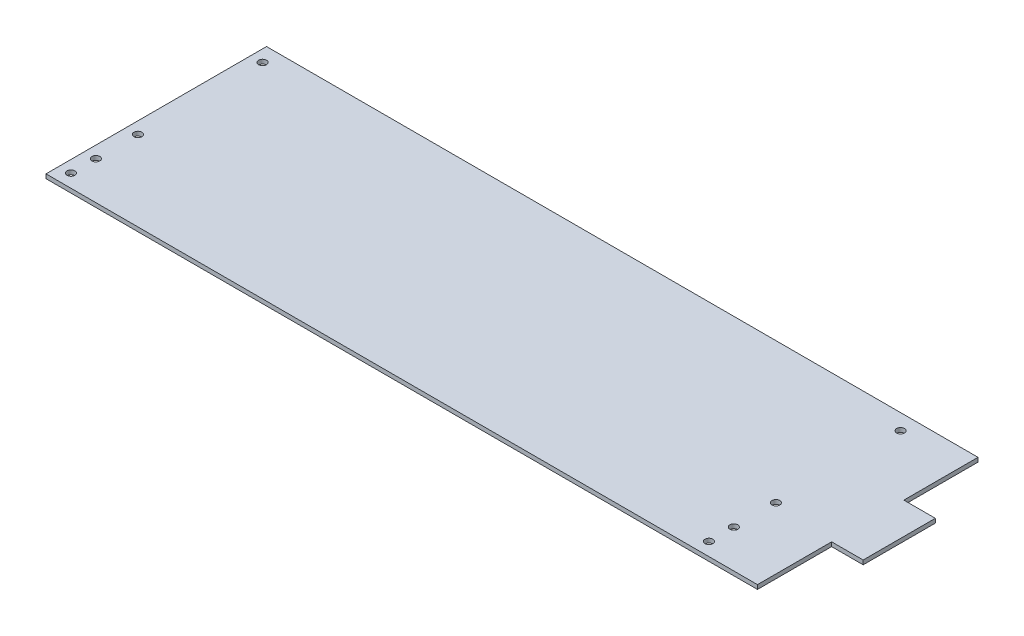
ISO-10303-21;
HEADER;
FILE_DESCRIPTION(('STEP AP214'),'2;1');
FILE_NAME('part.step','',(''),(''),'','','');
FILE_SCHEMA(('AUTOMOTIVE_DESIGN { 1 0 10303 214 1 1 1 1 }'));
ENDSEC;
DATA;
#1=APPLICATION_CONTEXT('core data for automotive mechanical design processes');
#2=APPLICATION_PROTOCOL_DEFINITION('international standard','automotive_design',2000,#1);
#3=PRODUCT_CONTEXT('',#1,'mechanical');
#4=PRODUCT('Part','Part','',(#3));
#5=PRODUCT_RELATED_PRODUCT_CATEGORY('part','',(#4));
#6=PRODUCT_DEFINITION_FORMATION('','',#4);
#7=PRODUCT_DEFINITION_CONTEXT('part definition',#1,'design');
#8=PRODUCT_DEFINITION('design','',#6,#7);
#9=PRODUCT_DEFINITION_SHAPE('','',#8);
#10=(LENGTH_UNIT() NAMED_UNIT(*) SI_UNIT(.MILLI.,.METRE.));
#11=(NAMED_UNIT(*) PLANE_ANGLE_UNIT() SI_UNIT($,.RADIAN.));
#12=(NAMED_UNIT(*) SI_UNIT($,.STERADIAN.) SOLID_ANGLE_UNIT());
#13=UNCERTAINTY_MEASURE_WITH_UNIT(LENGTH_MEASURE(1.E-05),#10,'distance_accuracy_value','');
#14=(GEOMETRIC_REPRESENTATION_CONTEXT(3) GLOBAL_UNCERTAINTY_ASSIGNED_CONTEXT((#13)) GLOBAL_UNIT_ASSIGNED_CONTEXT((#10,
#11,#12)) REPRESENTATION_CONTEXT('',''));
#15=CARTESIAN_POINT('',(0.,0.,0.));
#16=DIRECTION('',(0.,0.,1.));
#17=DIRECTION('',(1.,0.,0.));
#18=AXIS2_PLACEMENT_3D('',#15,#16,#17);
#19=CARTESIAN_POINT('',(283.,1.6,0.));
#20=DIRECTION('',(1.,0.,0.));
#21=DIRECTION('',(0.,0.,-1.));
#22=AXIS2_PLACEMENT_3D('',#19,#20,#21);
#23=PLANE('',#22);
#24=DIRECTION('',(0.,0.,1.));
#25=VECTOR('',#24,1.);
#26=CARTESIAN_POINT('',(283.,0.,0.));
#27=LINE('',#26,#25);
#28=CARTESIAN_POINT('',(283.,0.,-55.75));
#29=VERTEX_POINT('',#28);
#30=CARTESIAN_POINT('',(283.,0.,-28.25));
#31=VERTEX_POINT('',#30);
#32=EDGE_CURVE('E158',#29,#31,#27,.T.);
#33=ORIENTED_EDGE('',*,*,#32,.F.);
#34=DIRECTION('',(0.,-1.,0.));
#35=VECTOR('',#34,1.);
#36=CARTESIAN_POINT('',(283.,1.6,-55.75));
#37=LINE('',#36,#35);
#38=CARTESIAN_POINT('',(283.,1.6,-55.75));
#39=VERTEX_POINT('',#38);
#40=EDGE_CURVE('E11',#39,#29,#37,.T.);
#41=ORIENTED_EDGE('',*,*,#40,.F.);
#42=DIRECTION('',(0.,0.,1.));
#43=VECTOR('',#42,1.);
#44=CARTESIAN_POINT('',(283.,1.6,0.));
#45=LINE('',#44,#43);
#46=CARTESIAN_POINT('',(283.,1.6,-28.25));
#47=VERTEX_POINT('',#46);
#48=EDGE_CURVE('E202',#39,#47,#45,.T.);
#49=ORIENTED_EDGE('',*,*,#48,.T.);
#50=DIRECTION('',(0.,-1.,0.));
#51=VECTOR('',#50,1.);
#52=CARTESIAN_POINT('',(283.,1.6,-28.25));
#53=LINE('',#52,#51);
#54=EDGE_CURVE('E55',#47,#31,#53,.T.);
#55=ORIENTED_EDGE('',*,*,#54,.T.);
#56=EDGE_LOOP('',(#33,#41,#49,#55));
#57=FACE_BOUND('',#56,.T.);
#58=ADVANCED_FACE('F39',(#57),#23,.T.);
#59=CARTESIAN_POINT('',(0.,1.6,-55.75));
#60=DIRECTION('',(0.,0.,1.));
#61=DIRECTION('',(1.,0.,0.));
#62=AXIS2_PLACEMENT_3D('',#59,#60,#61);
#63=PLANE('',#62);
#64=DIRECTION('',(-1.,0.,0.));
#65=VECTOR('',#64,1.);
#66=CARTESIAN_POINT('',(0.,0.,-55.75));
#67=LINE('',#66,#65);
#68=CARTESIAN_POINT('',(271.,0.,-55.75));
#69=VERTEX_POINT('',#68);
#70=EDGE_CURVE('E160',#29,#69,#67,.T.);
#71=ORIENTED_EDGE('',*,*,#70,.T.);
#72=DIRECTION('',(0.,-1.,0.));
#73=VECTOR('',#72,1.);
#74=CARTESIAN_POINT('',(271.,1.6,-55.75));
#75=LINE('',#74,#73);
#76=CARTESIAN_POINT('',(271.,1.6,-55.75));
#77=VERTEX_POINT('',#76);
#78=EDGE_CURVE('E47',#77,#69,#75,.T.);
#79=ORIENTED_EDGE('',*,*,#78,.F.);
#80=DIRECTION('',(-1.,0.,0.));
#81=VECTOR('',#80,1.);
#82=CARTESIAN_POINT('',(0.,1.6,-55.75));
#83=LINE('',#82,#81);
#84=EDGE_CURVE('E228',#39,#77,#83,.T.);
#85=ORIENTED_EDGE('',*,*,#84,.F.);
#86=ORIENTED_EDGE('',*,*,#40,.T.);
#87=EDGE_LOOP('',(#71,#79,#85,#86));
#88=FACE_BOUND('',#87,.T.);
#89=ADVANCED_FACE('F218',(#88),#63,.F.);
#90=CARTESIAN_POINT('',(271.,1.6,0.));
#91=DIRECTION('',(1.,0.,0.));
#92=DIRECTION('',(0.,0.,-1.));
#93=AXIS2_PLACEMENT_3D('',#90,#91,#92);
#94=PLANE('',#93);
#95=DIRECTION('',(0.,0.,1.));
#96=VECTOR('',#95,1.);
#97=CARTESIAN_POINT('',(271.,0.,0.));
#98=LINE('',#97,#96);
#99=CARTESIAN_POINT('',(271.,0.,-84.));
#100=VERTEX_POINT('',#99);
#101=EDGE_CURVE('E163',#100,#69,#98,.T.);
#102=ORIENTED_EDGE('',*,*,#101,.F.);
#103=DIRECTION('',(0.,-1.,0.));
#104=VECTOR('',#103,1.);
#105=CARTESIAN_POINT('',(271.,1.6,-84.));
#106=LINE('',#105,#104);
#107=CARTESIAN_POINT('',(271.,1.6,-84.));
#108=VERTEX_POINT('',#107);
#109=EDGE_CURVE('E208',#108,#100,#106,.T.);
#110=ORIENTED_EDGE('',*,*,#109,.F.);
#111=DIRECTION('',(0.,0.,1.));
#112=VECTOR('',#111,1.);
#113=CARTESIAN_POINT('',(271.,1.6,0.));
#114=LINE('',#113,#112);
#115=EDGE_CURVE('E215',#108,#77,#114,.T.);
#116=ORIENTED_EDGE('',*,*,#115,.T.);
#117=ORIENTED_EDGE('',*,*,#78,.T.);
#118=EDGE_LOOP('',(#102,#110,#116,#117));
#119=FACE_BOUND('',#118,.T.);
#120=ADVANCED_FACE('F213',(#119),#94,.T.);
#121=CARTESIAN_POINT('',(0.,1.6,-84.));
#122=DIRECTION('',(0.,0.,-1.));
#123=DIRECTION('',(-1.,0.,0.));
#124=AXIS2_PLACEMENT_3D('',#121,#122,#123);
#125=PLANE('',#124);
#126=DIRECTION('',(1.,0.,0.));
#127=VECTOR('',#126,1.);
#128=CARTESIAN_POINT('',(0.,0.,-84.));
#129=LINE('',#128,#127);
#130=CARTESIAN_POINT('',(0.,0.,-84.));
#131=VERTEX_POINT('',#130);
#132=EDGE_CURVE('E166',#131,#100,#129,.T.);
#133=ORIENTED_EDGE('',*,*,#132,.F.);
#134=DIRECTION('',(0.,-1.,0.));
#135=VECTOR('',#134,1.);
#136=CARTESIAN_POINT('',(0.,1.6,-84.));
#137=LINE('',#136,#135);
#138=CARTESIAN_POINT('',(0.,1.6,-84.));
#139=VERTEX_POINT('',#138);
#140=EDGE_CURVE('E206',#139,#131,#137,.T.);
#141=ORIENTED_EDGE('',*,*,#140,.F.);
#142=DIRECTION('',(1.,0.,0.));
#143=VECTOR('',#142,1.);
#144=CARTESIAN_POINT('',(0.,1.6,-84.));
#145=LINE('',#144,#143);
#146=EDGE_CURVE('E227',#139,#108,#145,.T.);
#147=ORIENTED_EDGE('',*,*,#146,.T.);
#148=ORIENTED_EDGE('',*,*,#109,.T.);
#149=EDGE_LOOP('',(#133,#141,#147,#148));
#150=FACE_BOUND('',#149,.T.);
#151=ADVANCED_FACE('F225',(#150),#125,.T.);
#152=CARTESIAN_POINT('',(0.,1.6,0.));
#153=DIRECTION('',(-1.,0.,0.));
#154=DIRECTION('',(0.,0.,1.));
#155=AXIS2_PLACEMENT_3D('',#152,#153,#154);
#156=PLANE('',#155);
#157=DIRECTION('',(0.,0.,-1.));
#158=VECTOR('',#157,1.);
#159=CARTESIAN_POINT('',(0.,0.,0.));
#160=LINE('',#159,#158);
#161=CARTESIAN_POINT('',(0.,0.,0.));
#162=VERTEX_POINT('',#161);
#163=EDGE_CURVE('E169',#162,#131,#160,.T.);
#164=ORIENTED_EDGE('',*,*,#163,.F.);
#165=DIRECTION('',(0.,-1.,0.));
#166=VECTOR('',#165,1.);
#167=CARTESIAN_POINT('',(0.,1.6,0.));
#168=LINE('',#167,#166);
#169=CARTESIAN_POINT('',(0.,1.6,0.));
#170=VERTEX_POINT('',#169);
#171=EDGE_CURVE('E126',#170,#162,#168,.T.);
#172=ORIENTED_EDGE('',*,*,#171,.F.);
#173=DIRECTION('',(0.,0.,-1.));
#174=VECTOR('',#173,1.);
#175=CARTESIAN_POINT('',(0.,1.6,0.));
#176=LINE('',#175,#174);
#177=EDGE_CURVE('E116',#170,#139,#176,.T.);
#178=ORIENTED_EDGE('',*,*,#177,.T.);
#179=ORIENTED_EDGE('',*,*,#140,.T.);
#180=EDGE_LOOP('',(#164,#172,#178,#179));
#181=FACE_BOUND('',#180,.T.);
#182=ADVANCED_FACE('F234',(#181),#156,.T.);
#183=CARTESIAN_POINT('',(0.,1.6,0.));
#184=DIRECTION('',(0.,0.,-1.));
#185=DIRECTION('',(-1.,0.,0.));
#186=AXIS2_PLACEMENT_3D('',#183,#184,#185);
#187=PLANE('',#186);
#188=DIRECTION('',(1.,0.,0.));
#189=VECTOR('',#188,1.);
#190=CARTESIAN_POINT('',(0.,0.,0.));
#191=LINE('',#190,#189);
#192=CARTESIAN_POINT('',(271.,0.,0.));
#193=VERTEX_POINT('',#192);
#194=EDGE_CURVE('E123',#162,#193,#191,.T.);
#195=ORIENTED_EDGE('',*,*,#194,.T.);
#196=DIRECTION('',(0.,-1.,0.));
#197=VECTOR('',#196,1.);
#198=CARTESIAN_POINT('',(271.,1.6,0.));
#199=LINE('',#198,#197);
#200=CARTESIAN_POINT('',(271.,1.6,0.));
#201=VERTEX_POINT('',#200);
#202=EDGE_CURVE('E120',#201,#193,#199,.T.);
#203=ORIENTED_EDGE('',*,*,#202,.F.);
#204=DIRECTION('',(1.,0.,0.));
#205=VECTOR('',#204,1.);
#206=CARTESIAN_POINT('',(0.,1.6,0.));
#207=LINE('',#206,#205);
#208=EDGE_CURVE('E106',#170,#201,#207,.T.);
#209=ORIENTED_EDGE('',*,*,#208,.F.);
#210=ORIENTED_EDGE('',*,*,#171,.T.);
#211=EDGE_LOOP('',(#195,#203,#209,#210));
#212=FACE_BOUND('',#211,.T.);
#213=ADVANCED_FACE('F121',(#212),#187,.F.);
#214=CARTESIAN_POINT('',(271.,1.6,0.));
#215=DIRECTION('',(1.,0.,0.));
#216=DIRECTION('',(0.,0.,-1.));
#217=AXIS2_PLACEMENT_3D('',#214,#215,#216);
#218=PLANE('',#217);
#219=DIRECTION('',(0.,0.,1.));
#220=VECTOR('',#219,1.);
#221=CARTESIAN_POINT('',(271.,0.,0.));
#222=LINE('',#221,#220);
#223=CARTESIAN_POINT('',(271.,0.,-28.25));
#224=VERTEX_POINT('',#223);
#225=EDGE_CURVE('E173',#224,#193,#222,.T.);
#226=ORIENTED_EDGE('',*,*,#225,.F.);
#227=DIRECTION('',(0.,-1.,0.));
#228=VECTOR('',#227,1.);
#229=CARTESIAN_POINT('',(271.,1.6,-28.25));
#230=LINE('',#229,#228);
#231=CARTESIAN_POINT('',(271.,1.6,-28.25));
#232=VERTEX_POINT('',#231);
#233=EDGE_CURVE('E80',#232,#224,#230,.T.);
#234=ORIENTED_EDGE('',*,*,#233,.F.);
#235=DIRECTION('',(0.,0.,1.));
#236=VECTOR('',#235,1.);
#237=CARTESIAN_POINT('',(271.,1.6,0.));
#238=LINE('',#237,#236);
#239=EDGE_CURVE('E113',#232,#201,#238,.T.);
#240=ORIENTED_EDGE('',*,*,#239,.T.);
#241=ORIENTED_EDGE('',*,*,#202,.T.);
#242=EDGE_LOOP('',(#226,#234,#240,#241));
#243=FACE_BOUND('',#242,.T.);
#244=ADVANCED_FACE('F128',(#243),#218,.T.);
#245=CARTESIAN_POINT('',(4.5,1.6,-4.99999999999998));
#246=DIRECTION('',(0.,-1.,0.));
#247=DIRECTION('',(0.,0.,-1.));
#248=AXIS2_PLACEMENT_3D('',#245,#246,#247);
#249=CYLINDRICAL_SURFACE('',#248,1.5);
#250=CARTESIAN_POINT('',(4.5,1.6,-4.99999999999998));
#251=DIRECTION('',(0.,1.,0.));
#252=DIRECTION('',(0.,0.,1.));
#253=AXIS2_PLACEMENT_3D('',#250,#251,#252);
#254=CIRCLE('',#253,1.5);
#255=CARTESIAN_POINT('',(4.5,1.6,-3.49999999999998));
#256=VERTEX_POINT('',#255);
#257=EDGE_CURVE('E152',#256,#256,#254,.T.);
#258=ORIENTED_EDGE('',*,*,#257,.T.);
#259=EDGE_LOOP('',(#258));
#260=FACE_BOUND('',#259,.T.);
#261=CARTESIAN_POINT('',(4.5,0.,-4.99999999999998));
#262=DIRECTION('',(0.,1.,0.));
#263=DIRECTION('',(0.,0.,1.));
#264=AXIS2_PLACEMENT_3D('',#261,#262,#263);
#265=CIRCLE('',#264,1.5);
#266=CARTESIAN_POINT('',(4.5,0.,-3.49999999999998));
#267=VERTEX_POINT('',#266);
#268=EDGE_CURVE('E196',#267,#267,#265,.T.);
#269=ORIENTED_EDGE('',*,*,#268,.F.);
#270=EDGE_LOOP('',(#269));
#271=FACE_BOUND('',#270,.T.);
#272=ADVANCED_FACE('F265',(#260,#271),#249,.F.);
#273=CARTESIAN_POINT('',(4.5,1.6,-14.5));
#274=DIRECTION('',(0.,-1.,0.));
#275=DIRECTION('',(0.,0.,-1.));
#276=AXIS2_PLACEMENT_3D('',#273,#274,#275);
#277=CYLINDRICAL_SURFACE('',#276,1.5);
#278=CARTESIAN_POINT('',(4.5,1.6,-14.5));
#279=DIRECTION('',(0.,1.,0.));
#280=DIRECTION('',(0.,0.,1.));
#281=AXIS2_PLACEMENT_3D('',#278,#279,#280);
#282=CIRCLE('',#281,1.5);
#283=CARTESIAN_POINT('',(4.5,1.6,-13.));
#284=VERTEX_POINT('',#283);
#285=EDGE_CURVE('E149',#284,#284,#282,.T.);
#286=ORIENTED_EDGE('',*,*,#285,.T.);
#287=EDGE_LOOP('',(#286));
#288=FACE_BOUND('',#287,.T.);
#289=CARTESIAN_POINT('',(4.5,0.,-14.5));
#290=DIRECTION('',(0.,1.,0.));
#291=DIRECTION('',(0.,0.,1.));
#292=AXIS2_PLACEMENT_3D('',#289,#290,#291);
#293=CIRCLE('',#292,1.5);
#294=CARTESIAN_POINT('',(4.5,0.,-13.));
#295=VERTEX_POINT('',#294);
#296=EDGE_CURVE('E193',#295,#295,#293,.T.);
#297=ORIENTED_EDGE('',*,*,#296,.F.);
#298=EDGE_LOOP('',(#297));
#299=FACE_BOUND('',#298,.T.);
#300=ADVANCED_FACE('F269',(#288,#299),#277,.F.);
#301=CARTESIAN_POINT('',(4.5,1.6,-30.5));
#302=DIRECTION('',(0.,-1.,0.));
#303=DIRECTION('',(0.,0.,-1.));
#304=AXIS2_PLACEMENT_3D('',#301,#302,#303);
#305=CYLINDRICAL_SURFACE('',#304,1.5);
#306=CARTESIAN_POINT('',(4.5,1.6,-30.5));
#307=DIRECTION('',(0.,1.,0.));
#308=DIRECTION('',(0.,0.,1.));
#309=AXIS2_PLACEMENT_3D('',#306,#307,#308);
#310=CIRCLE('',#309,1.5);
#311=CARTESIAN_POINT('',(4.5,1.6,-29.));
#312=VERTEX_POINT('',#311);
#313=EDGE_CURVE('E146',#312,#312,#310,.T.);
#314=ORIENTED_EDGE('',*,*,#313,.T.);
#315=EDGE_LOOP('',(#314));
#316=FACE_BOUND('',#315,.T.);
#317=CARTESIAN_POINT('',(4.5,0.,-30.5));
#318=DIRECTION('',(0.,1.,0.));
#319=DIRECTION('',(0.,0.,1.));
#320=AXIS2_PLACEMENT_3D('',#317,#318,#319);
#321=CIRCLE('',#320,1.5);
#322=CARTESIAN_POINT('',(4.5,0.,-29.));
#323=VERTEX_POINT('',#322);
#324=EDGE_CURVE('E190',#323,#323,#321,.T.);
#325=ORIENTED_EDGE('',*,*,#324,.F.);
#326=EDGE_LOOP('',(#325));
#327=FACE_BOUND('',#326,.T.);
#328=ADVANCED_FACE('F275',(#316,#327),#305,.F.);
#329=CARTESIAN_POINT('',(247.5,1.6,-14.5));
#330=DIRECTION('',(0.,-1.,0.));
#331=DIRECTION('',(0.,0.,-1.));
#332=AXIS2_PLACEMENT_3D('',#329,#330,#331);
#333=CYLINDRICAL_SURFACE('',#332,1.5);
#334=CARTESIAN_POINT('',(247.5,1.6,-14.5));
#335=DIRECTION('',(0.,1.,0.));
#336=DIRECTION('',(0.,0.,1.));
#337=AXIS2_PLACEMENT_3D('',#334,#335,#336);
#338=CIRCLE('',#337,1.5);
#339=CARTESIAN_POINT('',(247.5,1.6,-13.));
#340=VERTEX_POINT('',#339);
#341=EDGE_CURVE('E143',#340,#340,#338,.F.);
#342=ORIENTED_EDGE('',*,*,#341,.F.);
#343=EDGE_LOOP('',(#342));
#344=FACE_BOUND('',#343,.T.);
#345=CARTESIAN_POINT('',(247.5,0.,-14.5));
#346=DIRECTION('',(0.,1.,0.));
#347=DIRECTION('',(0.,0.,1.));
#348=AXIS2_PLACEMENT_3D('',#345,#346,#347);
#349=CIRCLE('',#348,1.5);
#350=CARTESIAN_POINT('',(247.5,0.,-13.));
#351=VERTEX_POINT('',#350);
#352=EDGE_CURVE('E187',#351,#351,#349,.F.);
#353=ORIENTED_EDGE('',*,*,#352,.T.);
#354=EDGE_LOOP('',(#353));
#355=FACE_BOUND('',#354,.T.);
#356=ADVANCED_FACE('F283',(#344,#355),#333,.F.);
#357=CARTESIAN_POINT('',(247.5,1.6,-5.00000000000003));
#358=DIRECTION('',(0.,-1.,0.));
#359=DIRECTION('',(0.,0.,-1.));
#360=AXIS2_PLACEMENT_3D('',#357,#358,#359);
#361=CYLINDRICAL_SURFACE('',#360,1.5);
#362=CARTESIAN_POINT('',(247.5,1.6,-5.00000000000003));
#363=DIRECTION('',(0.,1.,0.));
#364=DIRECTION('',(0.,0.,1.));
#365=AXIS2_PLACEMENT_3D('',#362,#363,#364);
#366=CIRCLE('',#365,1.5);
#367=CARTESIAN_POINT('',(247.5,1.6,-3.50000000000004));
#368=VERTEX_POINT('',#367);
#369=EDGE_CURVE('E140',#368,#368,#366,.F.);
#370=ORIENTED_EDGE('',*,*,#369,.F.);
#371=EDGE_LOOP('',(#370));
#372=FACE_BOUND('',#371,.T.);
#373=CARTESIAN_POINT('',(247.5,0.,-5.00000000000003));
#374=DIRECTION('',(0.,1.,0.));
#375=DIRECTION('',(0.,0.,1.));
#376=AXIS2_PLACEMENT_3D('',#373,#374,#375);
#377=CIRCLE('',#376,1.5);
#378=CARTESIAN_POINT('',(247.5,0.,-3.50000000000004));
#379=VERTEX_POINT('',#378);
#380=EDGE_CURVE('E184',#379,#379,#377,.F.);
#381=ORIENTED_EDGE('',*,*,#380,.T.);
#382=EDGE_LOOP('',(#381));
#383=FACE_BOUND('',#382,.T.);
#384=ADVANCED_FACE('F287',(#372,#383),#361,.F.);
#385=CARTESIAN_POINT('',(247.5,1.6,-78.));
#386=DIRECTION('',(0.,-1.,0.));
#387=DIRECTION('',(0.,0.,-1.));
#388=AXIS2_PLACEMENT_3D('',#385,#386,#387);
#389=CYLINDRICAL_SURFACE('',#388,1.5);
#390=CARTESIAN_POINT('',(247.5,1.6,-78.));
#391=DIRECTION('',(0.,1.,0.));
#392=DIRECTION('',(0.,0.,1.));
#393=AXIS2_PLACEMENT_3D('',#390,#391,#392);
#394=CIRCLE('',#393,1.5);
#395=CARTESIAN_POINT('',(247.5,1.6,-76.5));
#396=VERTEX_POINT('',#395);
#397=EDGE_CURVE('E137',#396,#396,#394,.F.);
#398=ORIENTED_EDGE('',*,*,#397,.F.);
#399=EDGE_LOOP('',(#398));
#400=FACE_BOUND('',#399,.T.);
#401=CARTESIAN_POINT('',(247.5,0.,-78.));
#402=DIRECTION('',(0.,1.,0.));
#403=DIRECTION('',(0.,0.,1.));
#404=AXIS2_PLACEMENT_3D('',#401,#402,#403);
#405=CIRCLE('',#404,1.5);
#406=CARTESIAN_POINT('',(247.5,0.,-76.5));
#407=VERTEX_POINT('',#406);
#408=EDGE_CURVE('E181',#407,#407,#405,.F.);
#409=ORIENTED_EDGE('',*,*,#408,.T.);
#410=EDGE_LOOP('',(#409));
#411=FACE_BOUND('',#410,.T.);
#412=ADVANCED_FACE('F246',(#400,#411),#389,.F.);
#413=CARTESIAN_POINT('',(247.5,1.6,-30.5));
#414=DIRECTION('',(0.,-1.,0.));
#415=DIRECTION('',(0.,0.,-1.));
#416=AXIS2_PLACEMENT_3D('',#413,#414,#415);
#417=CYLINDRICAL_SURFACE('',#416,1.5);
#418=CARTESIAN_POINT('',(247.5,1.6,-30.5));
#419=DIRECTION('',(0.,1.,0.));
#420=DIRECTION('',(0.,0.,1.));
#421=AXIS2_PLACEMENT_3D('',#418,#419,#420);
#422=CIRCLE('',#421,1.5);
#423=CARTESIAN_POINT('',(247.5,1.6,-29.));
#424=VERTEX_POINT('',#423);
#425=EDGE_CURVE('E131',#424,#424,#422,.F.);
#426=ORIENTED_EDGE('',*,*,#425,.F.);
#427=EDGE_LOOP('',(#426));
#428=FACE_BOUND('',#427,.T.);
#429=CARTESIAN_POINT('',(247.5,0.,-30.5));
#430=DIRECTION('',(0.,1.,0.));
#431=DIRECTION('',(0.,0.,1.));
#432=AXIS2_PLACEMENT_3D('',#429,#430,#431);
#433=CIRCLE('',#432,1.5);
#434=CARTESIAN_POINT('',(247.5,0.,-29.));
#435=VERTEX_POINT('',#434);
#436=EDGE_CURVE('E178',#435,#435,#433,.F.);
#437=ORIENTED_EDGE('',*,*,#436,.T.);
#438=EDGE_LOOP('',(#437));
#439=FACE_BOUND('',#438,.T.);
#440=ADVANCED_FACE('F238',(#428,#439),#417,.F.);
#441=CARTESIAN_POINT('',(0.,1.6,-28.25));
#442=DIRECTION('',(0.,0.,1.));
#443=DIRECTION('',(1.,0.,0.));
#444=AXIS2_PLACEMENT_3D('',#441,#442,#443);
#445=PLANE('',#444);
#446=DIRECTION('',(-1.,0.,0.));
#447=VECTOR('',#446,1.);
#448=CARTESIAN_POINT('',(0.,0.,-28.25));
#449=LINE('',#448,#447);
#450=EDGE_CURVE('E175',#31,#224,#449,.T.);
#451=ORIENTED_EDGE('',*,*,#450,.F.);
#452=ORIENTED_EDGE('',*,*,#54,.F.);
#453=DIRECTION('',(-1.,0.,0.));
#454=VECTOR('',#453,1.);
#455=CARTESIAN_POINT('',(0.,1.6,-28.25));
#456=LINE('',#455,#454);
#457=EDGE_CURVE('E129',#47,#232,#456,.T.);
#458=ORIENTED_EDGE('',*,*,#457,.T.);
#459=ORIENTED_EDGE('',*,*,#233,.T.);
#460=EDGE_LOOP('',(#451,#452,#458,#459));
#461=FACE_BOUND('',#460,.T.);
#462=ADVANCED_FACE('F235',(#461),#445,.T.);
#463=CARTESIAN_POINT('',(4.5,1.6,-78.));
#464=DIRECTION('',(0.,-1.,0.));
#465=DIRECTION('',(0.,0.,-1.));
#466=AXIS2_PLACEMENT_3D('',#463,#464,#465);
#467=CYLINDRICAL_SURFACE('',#466,1.5);
#468=CARTESIAN_POINT('',(4.5,1.6,-78.));
#469=DIRECTION('',(0.,1.,0.));
#470=DIRECTION('',(0.,0.,1.));
#471=AXIS2_PLACEMENT_3D('',#468,#469,#470);
#472=CIRCLE('',#471,1.5);
#473=CARTESIAN_POINT('',(4.5,1.6,-76.5));
#474=VERTEX_POINT('',#473);
#475=EDGE_CURVE('E155',#474,#474,#472,.T.);
#476=ORIENTED_EDGE('',*,*,#475,.T.);
#477=EDGE_LOOP('',(#476));
#478=FACE_BOUND('',#477,.T.);
#479=CARTESIAN_POINT('',(4.5,0.,-78.));
#480=DIRECTION('',(0.,1.,0.));
#481=DIRECTION('',(0.,0.,1.));
#482=AXIS2_PLACEMENT_3D('',#479,#480,#481);
#483=CIRCLE('',#482,1.5);
#484=CARTESIAN_POINT('',(4.5,0.,-76.5));
#485=VERTEX_POINT('',#484);
#486=EDGE_CURVE('E199',#485,#485,#483,.T.);
#487=ORIENTED_EDGE('',*,*,#486,.F.);
#488=EDGE_LOOP('',(#487));
#489=FACE_BOUND('',#488,.T.);
#490=ADVANCED_FACE('F237',(#478,#489),#467,.F.);
#491=CARTESIAN_POINT('',(0.,1.6,0.));
#492=DIRECTION('',(0.,1.,0.));
#493=DIRECTION('',(0.,0.,1.));
#494=AXIS2_PLACEMENT_3D('',#491,#492,#493);
#495=PLANE('',#494);
#496=ORIENTED_EDGE('',*,*,#48,.F.);
#497=ORIENTED_EDGE('',*,*,#84,.T.);
#498=ORIENTED_EDGE('',*,*,#115,.F.);
#499=ORIENTED_EDGE('',*,*,#146,.F.);
#500=ORIENTED_EDGE('',*,*,#177,.F.);
#501=ORIENTED_EDGE('',*,*,#208,.T.);
#502=ORIENTED_EDGE('',*,*,#239,.F.);
#503=ORIENTED_EDGE('',*,*,#457,.F.);
#504=EDGE_LOOP('',(#496,#497,#498,#499,#500,#501,#502,#503));
#505=FACE_BOUND('',#504,.T.);
#506=ORIENTED_EDGE('',*,*,#425,.T.);
#507=EDGE_LOOP('',(#506));
#508=FACE_BOUND('',#507,.T.);
#509=ORIENTED_EDGE('',*,*,#397,.T.);
#510=EDGE_LOOP('',(#509));
#511=FACE_BOUND('',#510,.T.);
#512=ORIENTED_EDGE('',*,*,#369,.T.);
#513=EDGE_LOOP('',(#512));
#514=FACE_BOUND('',#513,.T.);
#515=ORIENTED_EDGE('',*,*,#341,.T.);
#516=EDGE_LOOP('',(#515));
#517=FACE_BOUND('',#516,.T.);
#518=ORIENTED_EDGE('',*,*,#313,.F.);
#519=EDGE_LOOP('',(#518));
#520=FACE_BOUND('',#519,.T.);
#521=ORIENTED_EDGE('',*,*,#285,.F.);
#522=EDGE_LOOP('',(#521));
#523=FACE_BOUND('',#522,.T.);
#524=ORIENTED_EDGE('',*,*,#257,.F.);
#525=EDGE_LOOP('',(#524));
#526=FACE_BOUND('',#525,.T.);
#527=ORIENTED_EDGE('',*,*,#475,.F.);
#528=EDGE_LOOP('',(#527));
#529=FACE_BOUND('',#528,.T.);
#530=ADVANCED_FACE('F109',(#505,#508,#511,#514,#517,#520,#523,#526,#529),#495,.T.);
#531=CARTESIAN_POINT('',(0.,0.,0.));
#532=DIRECTION('',(0.,1.,0.));
#533=DIRECTION('',(0.,0.,1.));
#534=AXIS2_PLACEMENT_3D('',#531,#532,#533);
#535=PLANE('',#534);
#536=ORIENTED_EDGE('',*,*,#32,.T.);
#537=ORIENTED_EDGE('',*,*,#450,.T.);
#538=ORIENTED_EDGE('',*,*,#225,.T.);
#539=ORIENTED_EDGE('',*,*,#194,.F.);
#540=ORIENTED_EDGE('',*,*,#163,.T.);
#541=ORIENTED_EDGE('',*,*,#132,.T.);
#542=ORIENTED_EDGE('',*,*,#101,.T.);
#543=ORIENTED_EDGE('',*,*,#70,.F.);
#544=EDGE_LOOP('',(#536,#537,#538,#539,#540,#541,#542,#543));
#545=FACE_BOUND('',#544,.T.);
#546=ORIENTED_EDGE('',*,*,#436,.F.);
#547=EDGE_LOOP('',(#546));
#548=FACE_BOUND('',#547,.T.);
#549=ORIENTED_EDGE('',*,*,#408,.F.);
#550=EDGE_LOOP('',(#549));
#551=FACE_BOUND('',#550,.T.);
#552=ORIENTED_EDGE('',*,*,#380,.F.);
#553=EDGE_LOOP('',(#552));
#554=FACE_BOUND('',#553,.T.);
#555=ORIENTED_EDGE('',*,*,#352,.F.);
#556=EDGE_LOOP('',(#555));
#557=FACE_BOUND('',#556,.T.);
#558=ORIENTED_EDGE('',*,*,#324,.T.);
#559=EDGE_LOOP('',(#558));
#560=FACE_BOUND('',#559,.T.);
#561=ORIENTED_EDGE('',*,*,#296,.T.);
#562=EDGE_LOOP('',(#561));
#563=FACE_BOUND('',#562,.T.);
#564=ORIENTED_EDGE('',*,*,#268,.T.);
#565=EDGE_LOOP('',(#564));
#566=FACE_BOUND('',#565,.T.);
#567=ORIENTED_EDGE('',*,*,#486,.T.);
#568=EDGE_LOOP('',(#567));
#569=FACE_BOUND('',#568,.T.);
#570=ADVANCED_FACE('F220',(#545,#548,#551,#554,#557,#560,#563,#566,#569),#535,.F.);
#571=CLOSED_SHELL('',(#58,#89,#120,#151,#182,#213,#244,#272,#300,#328,#356,#384,#412,#440,#462,
#490,#530,#570));
#572=MANIFOLD_SOLID_BREP('B2',#571);
#573=ADVANCED_BREP_SHAPE_REPRESENTATION('',(#18,#572),#14);
#574=SHAPE_DEFINITION_REPRESENTATION(#9,#573);
ENDSEC;
END-ISO-10303-21;
